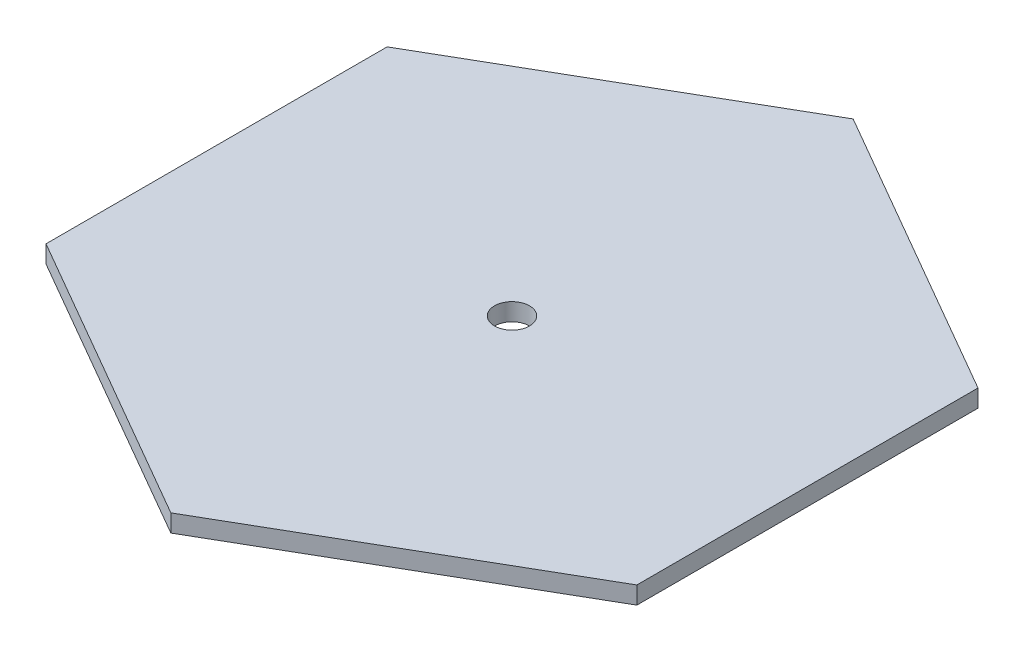
ISO-10303-21;
HEADER;
FILE_DESCRIPTION(('STEP AP214'),'2;1');
FILE_NAME('part.step','',(''),(''),'','','');
FILE_SCHEMA(('AUTOMOTIVE_DESIGN { 1 0 10303 214 1 1 1 1 }'));
ENDSEC;
DATA;
#1=APPLICATION_CONTEXT('core data for automotive mechanical design processes');
#2=APPLICATION_PROTOCOL_DEFINITION('international standard','automotive_design',2000,#1);
#3=PRODUCT_CONTEXT('',#1,'mechanical');
#4=PRODUCT('Part','Part','',(#3));
#5=PRODUCT_RELATED_PRODUCT_CATEGORY('part','',(#4));
#6=PRODUCT_DEFINITION_FORMATION('','',#4);
#7=PRODUCT_DEFINITION_CONTEXT('part definition',#1,'design');
#8=PRODUCT_DEFINITION('design','',#6,#7);
#9=PRODUCT_DEFINITION_SHAPE('','',#8);
#10=(LENGTH_UNIT() NAMED_UNIT(*) SI_UNIT(.MILLI.,.METRE.));
#11=(NAMED_UNIT(*) PLANE_ANGLE_UNIT() SI_UNIT($,.RADIAN.));
#12=(NAMED_UNIT(*) SI_UNIT($,.STERADIAN.) SOLID_ANGLE_UNIT());
#13=UNCERTAINTY_MEASURE_WITH_UNIT(LENGTH_MEASURE(1.E-05),#10,'distance_accuracy_value','');
#14=(GEOMETRIC_REPRESENTATION_CONTEXT(3) GLOBAL_UNCERTAINTY_ASSIGNED_CONTEXT((#13)) GLOBAL_UNIT_ASSIGNED_CONTEXT((#10,
#11,#12)) REPRESENTATION_CONTEXT('',''));
#15=CARTESIAN_POINT('',(0.,0.,0.));
#16=DIRECTION('',(0.,0.,1.));
#17=DIRECTION('',(1.,0.,0.));
#18=AXIS2_PLACEMENT_3D('',#15,#16,#17);
#19=CARTESIAN_POINT('',(33.7749907475931,2.,19.5));
#20=DIRECTION('',(-1.,0.,0.));
#21=DIRECTION('',(0.,0.,1.));
#22=AXIS2_PLACEMENT_3D('',#19,#20,#21);
#23=PLANE('',#22);
#24=DIRECTION('',(0.,0.,-1.));
#25=VECTOR('',#24,1.);
#26=CARTESIAN_POINT('',(33.7749907475931,0.,19.5));
#27=LINE('',#26,#25);
#28=CARTESIAN_POINT('',(33.7749907475931,0.,19.5));
#29=VERTEX_POINT('',#28);
#30=CARTESIAN_POINT('',(33.7749907475931,0.,-19.5));
#31=VERTEX_POINT('',#30);
#32=EDGE_CURVE('E117',#29,#31,#27,.T.);
#33=ORIENTED_EDGE('',*,*,#32,.T.);
#34=DIRECTION('',(0.,-1.,0.));
#35=VECTOR('',#34,1.);
#36=CARTESIAN_POINT('',(33.7749907475931,2.,-19.5));
#37=LINE('',#36,#35);
#38=CARTESIAN_POINT('',(33.7749907475931,2.,-19.5));
#39=VERTEX_POINT('',#38);
#40=EDGE_CURVE('E11',#39,#31,#37,.T.);
#41=ORIENTED_EDGE('',*,*,#40,.F.);
#42=DIRECTION('',(0.,0.,-1.));
#43=VECTOR('',#42,1.);
#44=CARTESIAN_POINT('',(33.7749907475931,2.,19.5));
#45=LINE('',#44,#43);
#46=CARTESIAN_POINT('',(33.7749907475931,2.,19.5));
#47=VERTEX_POINT('',#46);
#48=EDGE_CURVE('E128',#47,#39,#45,.T.);
#49=ORIENTED_EDGE('',*,*,#48,.F.);
#50=DIRECTION('',(0.,-1.,0.));
#51=VECTOR('',#50,1.);
#52=CARTESIAN_POINT('',(33.7749907475931,2.,19.5));
#53=LINE('',#52,#51);
#54=EDGE_CURVE('E113',#47,#29,#53,.T.);
#55=ORIENTED_EDGE('',*,*,#54,.T.);
#56=EDGE_LOOP('',(#33,#41,#49,#55));
#57=FACE_BOUND('',#56,.T.);
#58=ADVANCED_FACE('F33',(#57),#23,.F.);
#59=CARTESIAN_POINT('',(33.7749907475931,2.,-19.5));
#60=DIRECTION('',(-0.5,0.,0.866025403784439));
#61=DIRECTION('',(0.866025403784439,0.,0.5));
#62=AXIS2_PLACEMENT_3D('',#59,#60,#61);
#63=PLANE('',#62);
#64=DIRECTION('',(-0.866025403784439,0.,-0.5));
#65=VECTOR('',#64,1.);
#66=CARTESIAN_POINT('',(33.7749907475931,0.,-19.5));
#67=LINE('',#66,#65);
#68=CARTESIAN_POINT('',(0.,0.,-39.));
#69=VERTEX_POINT('',#68);
#70=EDGE_CURVE('E120',#31,#69,#67,.T.);
#71=ORIENTED_EDGE('',*,*,#70,.T.);
#72=DIRECTION('',(0.,-1.,0.));
#73=VECTOR('',#72,1.);
#74=CARTESIAN_POINT('',(0.,2.,-39.));
#75=LINE('',#74,#73);
#76=CARTESIAN_POINT('',(0.,2.,-39.));
#77=VERTEX_POINT('',#76);
#78=EDGE_CURVE('E41',#77,#69,#75,.T.);
#79=ORIENTED_EDGE('',*,*,#78,.F.);
#80=DIRECTION('',(-0.866025403784439,0.,-0.5));
#81=VECTOR('',#80,1.);
#82=CARTESIAN_POINT('',(33.7749907475931,2.,-19.5));
#83=LINE('',#82,#81);
#84=EDGE_CURVE('E86',#39,#77,#83,.T.);
#85=ORIENTED_EDGE('',*,*,#84,.F.);
#86=ORIENTED_EDGE('',*,*,#40,.T.);
#87=EDGE_LOOP('',(#71,#79,#85,#86));
#88=FACE_BOUND('',#87,.T.);
#89=ADVANCED_FACE('F153',(#88),#63,.F.);
#90=CARTESIAN_POINT('',(0.,2.,-39.));
#91=DIRECTION('',(0.5,0.,0.866025403784439));
#92=DIRECTION('',(0.866025403784439,0.,-0.5));
#93=AXIS2_PLACEMENT_3D('',#90,#91,#92);
#94=PLANE('',#93);
#95=DIRECTION('',(-0.866025403784439,0.,0.5));
#96=VECTOR('',#95,1.);
#97=CARTESIAN_POINT('',(0.,0.,-39.));
#98=LINE('',#97,#96);
#99=CARTESIAN_POINT('',(-33.7749907475931,0.,-19.5));
#100=VERTEX_POINT('',#99);
#101=EDGE_CURVE('E123',#69,#100,#98,.T.);
#102=ORIENTED_EDGE('',*,*,#101,.T.);
#103=DIRECTION('',(0.,-1.,0.));
#104=VECTOR('',#103,1.);
#105=CARTESIAN_POINT('',(-33.7749907475931,2.,-19.5));
#106=LINE('',#105,#104);
#107=CARTESIAN_POINT('',(-33.7749907475931,2.,-19.5));
#108=VERTEX_POINT('',#107);
#109=EDGE_CURVE('E108',#108,#100,#106,.T.);
#110=ORIENTED_EDGE('',*,*,#109,.F.);
#111=DIRECTION('',(-0.866025403784439,0.,0.5));
#112=VECTOR('',#111,1.);
#113=CARTESIAN_POINT('',(0.,2.,-39.));
#114=LINE('',#113,#112);
#115=EDGE_CURVE('E99',#77,#108,#114,.T.);
#116=ORIENTED_EDGE('',*,*,#115,.F.);
#117=ORIENTED_EDGE('',*,*,#78,.T.);
#118=EDGE_LOOP('',(#102,#110,#116,#117));
#119=FACE_BOUND('',#118,.T.);
#120=ADVANCED_FACE('F134',(#119),#94,.F.);
#121=CARTESIAN_POINT('',(-33.7749907475931,2.,-19.5));
#122=DIRECTION('',(1.,0.,0.));
#123=DIRECTION('',(0.,0.,-1.));
#124=AXIS2_PLACEMENT_3D('',#121,#122,#123);
#125=PLANE('',#124);
#126=DIRECTION('',(0.,0.,1.));
#127=VECTOR('',#126,1.);
#128=CARTESIAN_POINT('',(-33.7749907475931,0.,-19.5));
#129=LINE('',#128,#127);
#130=CARTESIAN_POINT('',(-33.7749907475931,0.,19.5));
#131=VERTEX_POINT('',#130);
#132=EDGE_CURVE('E107',#100,#131,#129,.T.);
#133=ORIENTED_EDGE('',*,*,#132,.T.);
#134=DIRECTION('',(0.,-1.,0.));
#135=VECTOR('',#134,1.);
#136=CARTESIAN_POINT('',(-33.7749907475931,2.,19.5));
#137=LINE('',#136,#135);
#138=CARTESIAN_POINT('',(-33.7749907475931,2.,19.5));
#139=VERTEX_POINT('',#138);
#140=EDGE_CURVE('E104',#139,#131,#137,.T.);
#141=ORIENTED_EDGE('',*,*,#140,.F.);
#142=DIRECTION('',(0.,0.,1.));
#143=VECTOR('',#142,1.);
#144=CARTESIAN_POINT('',(-33.7749907475931,2.,-19.5));
#145=LINE('',#144,#143);
#146=EDGE_CURVE('E93',#108,#139,#145,.T.);
#147=ORIENTED_EDGE('',*,*,#146,.F.);
#148=ORIENTED_EDGE('',*,*,#109,.T.);
#149=EDGE_LOOP('',(#133,#141,#147,#148));
#150=FACE_BOUND('',#149,.T.);
#151=ADVANCED_FACE('F105',(#150),#125,.F.);
#152=CARTESIAN_POINT('',(-33.7749907475931,2.,19.5));
#153=DIRECTION('',(0.5,0.,-0.866025403784439));
#154=DIRECTION('',(-0.866025403784439,0.,-0.5));
#155=AXIS2_PLACEMENT_3D('',#152,#153,#154);
#156=PLANE('',#155);
#157=DIRECTION('',(0.866025403784439,0.,0.5));
#158=VECTOR('',#157,1.);
#159=CARTESIAN_POINT('',(-33.7749907475931,0.,19.5));
#160=LINE('',#159,#158);
#161=CARTESIAN_POINT('',(0.,0.,39.));
#162=VERTEX_POINT('',#161);
#163=EDGE_CURVE('E72',#131,#162,#160,.T.);
#164=ORIENTED_EDGE('',*,*,#163,.T.);
#165=DIRECTION('',(0.,-1.,0.));
#166=VECTOR('',#165,1.);
#167=CARTESIAN_POINT('',(0.,2.,39.));
#168=LINE('',#167,#166);
#169=CARTESIAN_POINT('',(0.,2.,39.));
#170=VERTEX_POINT('',#169);
#171=EDGE_CURVE('E109',#170,#162,#168,.T.);
#172=ORIENTED_EDGE('',*,*,#171,.F.);
#173=DIRECTION('',(0.866025403784439,0.,0.5));
#174=VECTOR('',#173,1.);
#175=CARTESIAN_POINT('',(-33.7749907475931,2.,19.5));
#176=LINE('',#175,#174);
#177=EDGE_CURVE('E97',#139,#170,#176,.T.);
#178=ORIENTED_EDGE('',*,*,#177,.F.);
#179=ORIENTED_EDGE('',*,*,#140,.T.);
#180=EDGE_LOOP('',(#164,#172,#178,#179));
#181=FACE_BOUND('',#180,.T.);
#182=ADVANCED_FACE('F111',(#181),#156,.F.);
#183=CARTESIAN_POINT('',(0.,2.,39.));
#184=DIRECTION('',(-0.5,0.,-0.866025403784439));
#185=DIRECTION('',(-0.866025403784439,0.,0.5));
#186=AXIS2_PLACEMENT_3D('',#183,#184,#185);
#187=PLANE('',#186);
#188=DIRECTION('',(0.866025403784439,0.,-0.5));
#189=VECTOR('',#188,1.);
#190=CARTESIAN_POINT('',(0.,0.,39.));
#191=LINE('',#190,#189);
#192=EDGE_CURVE('E78',#162,#29,#191,.T.);
#193=ORIENTED_EDGE('',*,*,#192,.T.);
#194=ORIENTED_EDGE('',*,*,#54,.F.);
#195=DIRECTION('',(0.866025403784439,0.,-0.5));
#196=VECTOR('',#195,1.);
#197=CARTESIAN_POINT('',(0.,2.,39.));
#198=LINE('',#197,#196);
#199=EDGE_CURVE('E49',#170,#47,#198,.T.);
#200=ORIENTED_EDGE('',*,*,#199,.F.);
#201=ORIENTED_EDGE('',*,*,#171,.T.);
#202=EDGE_LOOP('',(#193,#194,#200,#201));
#203=FACE_BOUND('',#202,.T.);
#204=ADVANCED_FACE('F141',(#203),#187,.F.);
#205=CARTESIAN_POINT('',(0.,2.,0.));
#206=DIRECTION('',(0.,1.,0.));
#207=DIRECTION('',(0.,0.,1.));
#208=AXIS2_PLACEMENT_3D('',#205,#206,#207);
#209=PLANE('',#208);
#210=CARTESIAN_POINT('',(0.,2.,0.));
#211=DIRECTION('',(0.,1.,0.));
#212=DIRECTION('',(0.,0.,1.));
#213=AXIS2_PLACEMENT_3D('',#210,#211,#212);
#214=CIRCLE('',#213,2.);
#215=CARTESIAN_POINT('',(0.,2.,2.));
#216=VERTEX_POINT('',#215);
#217=EDGE_CURVE('E206',#216,#216,#214,.T.);
#218=ORIENTED_EDGE('',*,*,#217,.F.);
#219=EDGE_LOOP('',(#218));
#220=FACE_BOUND('',#219,.T.);
#221=ORIENTED_EDGE('',*,*,#48,.T.);
#222=ORIENTED_EDGE('',*,*,#84,.T.);
#223=ORIENTED_EDGE('',*,*,#115,.T.);
#224=ORIENTED_EDGE('',*,*,#146,.T.);
#225=ORIENTED_EDGE('',*,*,#177,.T.);
#226=ORIENTED_EDGE('',*,*,#199,.T.);
#227=EDGE_LOOP('',(#221,#222,#223,#224,#225,#226));
#228=FACE_BOUND('',#227,.T.);
#229=ADVANCED_FACE('F95',(#220,#228),#209,.T.);
#230=CARTESIAN_POINT('',(0.,0.,0.));
#231=DIRECTION('',(0.,1.,0.));
#232=DIRECTION('',(0.,0.,1.));
#233=AXIS2_PLACEMENT_3D('',#230,#231,#232);
#234=PLANE('',#233);
#235=CARTESIAN_POINT('',(0.,0.,0.));
#236=DIRECTION('',(0.,1.,0.));
#237=DIRECTION('',(0.,0.,1.));
#238=AXIS2_PLACEMENT_3D('',#235,#236,#237);
#239=CIRCLE('',#238,2.);
#240=CARTESIAN_POINT('',(0.,0.,2.));
#241=VERTEX_POINT('',#240);
#242=EDGE_CURVE('E121',#241,#241,#239,.F.);
#243=ORIENTED_EDGE('',*,*,#242,.F.);
#244=EDGE_LOOP('',(#243));
#245=FACE_BOUND('',#244,.T.);
#246=ORIENTED_EDGE('',*,*,#32,.F.);
#247=ORIENTED_EDGE('',*,*,#192,.F.);
#248=ORIENTED_EDGE('',*,*,#163,.F.);
#249=ORIENTED_EDGE('',*,*,#132,.F.);
#250=ORIENTED_EDGE('',*,*,#101,.F.);
#251=ORIENTED_EDGE('',*,*,#70,.F.);
#252=EDGE_LOOP('',(#246,#247,#248,#249,#250,#251));
#253=FACE_BOUND('',#252,.T.);
#254=ADVANCED_FACE('F137',(#245,#253),#234,.F.);
#255=CARTESIAN_POINT('',(0.,-0.00100000000000013,0.));
#256=DIRECTION('',(0.,1.,0.));
#257=DIRECTION('',(0.,0.,1.));
#258=AXIS2_PLACEMENT_3D('',#255,#256,#257);
#259=CYLINDRICAL_SURFACE('',#258,2.);
#260=ORIENTED_EDGE('',*,*,#217,.T.);
#261=EDGE_LOOP('',(#260));
#262=FACE_BOUND('',#261,.T.);
#263=ORIENTED_EDGE('',*,*,#242,.T.);
#264=EDGE_LOOP('',(#263));
#265=FACE_BOUND('',#264,.T.);
#266=ADVANCED_FACE('F190',(#262,#265),#259,.F.);
#267=CLOSED_SHELL('',(#58,#89,#120,#151,#182,#204,#229,#254,#266));
#268=MANIFOLD_SOLID_BREP('B2',#267);
#269=ADVANCED_BREP_SHAPE_REPRESENTATION('',(#18,#268),#14);
#270=SHAPE_DEFINITION_REPRESENTATION(#9,#269);
ENDSEC;
END-ISO-10303-21;
